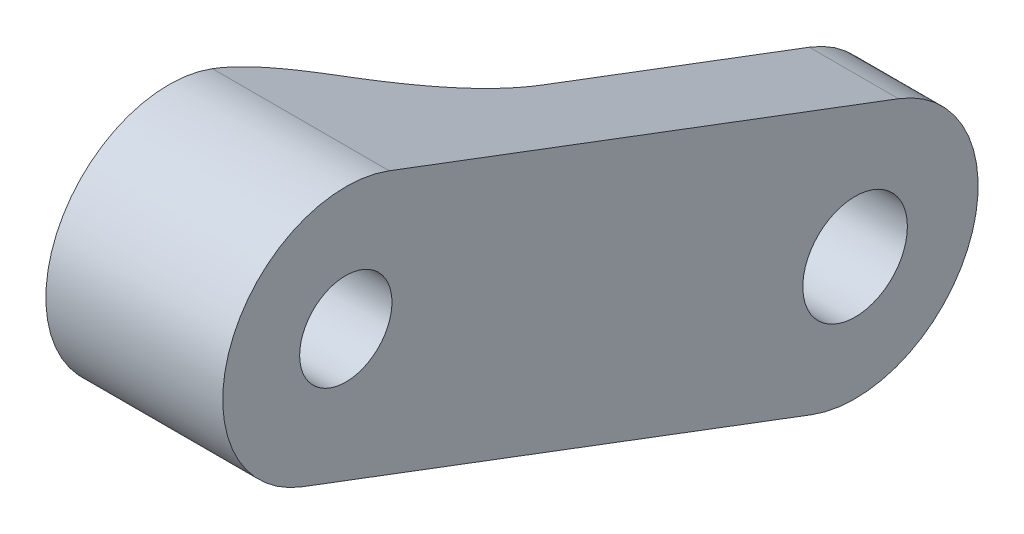
ISO-10303-21;
HEADER;
FILE_DESCRIPTION(('STEP AP214'),'2;1');
FILE_NAME('part.step','',(''),(''),'','','');
FILE_SCHEMA(('AUTOMOTIVE_DESIGN { 1 0 10303 214 1 1 1 1 }'));
ENDSEC;
DATA;
#1=APPLICATION_CONTEXT('core data for automotive mechanical design processes');
#2=APPLICATION_PROTOCOL_DEFINITION('international standard','automotive_design',2000,#1);
#3=PRODUCT_CONTEXT('',#1,'mechanical');
#4=PRODUCT('Part','Part','',(#3));
#5=PRODUCT_RELATED_PRODUCT_CATEGORY('part','',(#4));
#6=PRODUCT_DEFINITION_FORMATION('','',#4);
#7=PRODUCT_DEFINITION_CONTEXT('part definition',#1,'design');
#8=PRODUCT_DEFINITION('design','',#6,#7);
#9=PRODUCT_DEFINITION_SHAPE('','',#8);
#10=(LENGTH_UNIT() NAMED_UNIT(*) SI_UNIT(.MILLI.,.METRE.));
#11=(NAMED_UNIT(*) PLANE_ANGLE_UNIT() SI_UNIT($,.RADIAN.));
#12=(NAMED_UNIT(*) SI_UNIT($,.STERADIAN.) SOLID_ANGLE_UNIT());
#13=UNCERTAINTY_MEASURE_WITH_UNIT(LENGTH_MEASURE(1.E-05),#10,'distance_accuracy_value','');
#14=(GEOMETRIC_REPRESENTATION_CONTEXT(3) GLOBAL_UNCERTAINTY_ASSIGNED_CONTEXT((#13)) GLOBAL_UNIT_ASSIGNED_CONTEXT((#10,
#11,#12)) REPRESENTATION_CONTEXT('',''));
#15=CARTESIAN_POINT('',(0.,0.,0.));
#16=DIRECTION('',(0.,0.,1.));
#17=DIRECTION('',(1.,0.,0.));
#18=AXIS2_PLACEMENT_3D('',#15,#16,#17);
#19=CARTESIAN_POINT('',(44.302,-22.6776641920045,-71.2830619598758));
#20=DIRECTION('',(0.,0.935565570581021,-0.353153030771943));
#21=DIRECTION('',(-1.,0.,0.));
#22=AXIS2_PLACEMENT_3D('',#19,#20,#21);
#23=PLANE('',#22);
#24=DIRECTION('',(-1.,0.,0.));
#25=VECTOR('',#24,1.);
#26=CARTESIAN_POINT('',(44.302,-19.5526641920044,-63.0043777824384));
#27=LINE('',#26,#25);
#28=CARTESIAN_POINT('',(44.3,-19.5526641920044,-63.0043777824384));
#29=VERTEX_POINT('',#28);
#30=CARTESIAN_POINT('',(38.55,-19.5526641920044,-63.0043777824384));
#31=VERTEX_POINT('',#30);
#32=EDGE_CURVE('E117',#29,#31,#27,.T.);
#33=ORIENTED_EDGE('',*,*,#32,.F.);
#34=DIRECTION('',(0.,0.353153030771945,0.93556557058102));
#35=VECTOR('',#34,1.);
#36=CARTESIAN_POINT('',(44.3,-19.5526641920044,-63.0043777824384));
#37=LINE('',#36,#35);
#38=CARTESIAN_POINT('',(44.3,-25.8026641920046,-79.5617461373133));
#39=VERTEX_POINT('',#38);
#40=EDGE_CURVE('E131',#39,#29,#37,.T.);
#41=ORIENTED_EDGE('',*,*,#40,.F.);
#42=DIRECTION('',(-1.,0.,0.));
#43=VECTOR('',#42,1.);
#44=CARTESIAN_POINT('',(44.3,-25.8026641920046,-79.5617461373133));
#45=LINE('',#44,#43);
#46=CARTESIAN_POINT('',(41.4,-25.8026641920046,-79.5617461373133));
#47=VERTEX_POINT('',#46);
#48=EDGE_CURVE('E143',#39,#47,#45,.T.);
#49=ORIENTED_EDGE('',*,*,#48,.T.);
#50=DIRECTION('',(0.,0.353153030771945,0.93556557058102));
#51=VECTOR('',#50,1.);
#52=CARTESIAN_POINT('',(41.4,-19.5526641920044,-63.0043777824384));
#53=LINE('',#52,#51);
#54=CARTESIAN_POINT('',(41.4,-22.5314734420489,-70.8957765043415));
#55=VERTEX_POINT('',#54);
#56=EDGE_CURVE('E132',#47,#55,#53,.T.);
#57=ORIENTED_EDGE('',*,*,#56,.T.);
#58=CARTESIAN_POINT('',(41.4,-22.5314734420489,-70.8957765043415));
#59=CARTESIAN_POINT('',(41.4000277007138,-22.4610782446456,-70.7092870301301));
#60=CARTESIAN_POINT('',(41.3918932068011,-22.3907055309983,-70.5228571194116));
#61=CARTESIAN_POINT('',(41.3601510076592,-22.2504400113785,-70.1512686592783));
#62=CARTESIAN_POINT('',(41.3365535257737,-22.1805469191343,-69.9661093514785));
#63=CARTESIAN_POINT('',(41.2752739038295,-22.0427944731871,-69.6011784731853));
#64=CARTESIAN_POINT('',(41.2378448195937,-21.9749209159016,-69.4213692748602));
#65=CARTESIAN_POINT('',(41.1498304356229,-21.8402425746833,-69.0645822500642));
#66=CARTESIAN_POINT('',(41.0992428218886,-21.7734379809292,-68.8876049274107));
#67=CARTESIAN_POINT('',(40.964628535929,-21.6161990612663,-68.4710508933978));
#68=CARTESIAN_POINT('',(40.8751836034767,-21.5263414911862,-68.2330021114314));
#69=CARTESIAN_POINT('',(40.6763731462326,-21.3493451519056,-67.7641071375221));
#70=CARTESIAN_POINT('',(40.5669874549556,-21.2622092406282,-67.5332685167289));
#71=CARTESIAN_POINT('',(40.3892107174685,-21.132549651779,-67.1897770649979));
#72=CARTESIAN_POINT('',(40.3268212393555,-21.0889799221727,-67.0743530550437));
#73=CARTESIAN_POINT('',(40.1982796586261,-21.0025324043153,-66.845338111599));
#74=CARTESIAN_POINT('',(40.1321272404916,-20.9596546744757,-66.731747332851));
#75=CARTESIAN_POINT('',(39.9968095537605,-20.8746445187813,-66.506540218973));
#76=CARTESIAN_POINT('',(39.9276524181795,-20.8325104680575,-66.3949195792744));
#77=CARTESIAN_POINT('',(39.786851031847,-20.7487803074757,-66.1731034014878));
#78=CARTESIAN_POINT('',(39.7152075506957,-20.7071840365344,-66.0629074366616));
#79=CARTESIAN_POINT('',(39.6426406871192,-20.6657961120424,-65.9532634188603));
#80=B_SPLINE_CURVE_WITH_KNOTS('',3,(#58,#59,#60,#61,#62,#63,#64,#65,#66,#67,#68,#69,#70,#71,#72,
#73,#74,#75,#76,#77,#78,#79),.UNSPECIFIED.,.F.,.F.,(4,2,2,2,2,2,2,2,2,2,4),(0.,
0.597740368998136,1.19508594056136,1.7820041037666,2.36902554960083,3.17714083560147,
3.98607796480844,4.40077822352794,4.81551330579329,5.22918832677154,5.64273642510539),.UNSPECIFIED.);
#81=CARTESIAN_POINT('',(39.6426406871191,-20.6657961120423,-65.9532634188603));
#82=VERTEX_POINT('',#81);
#83=EDGE_CURVE('E64',#55,#82,#80,.T.);
#84=ORIENTED_EDGE('',*,*,#83,.T.);
#85=CARTESIAN_POINT('',(39.6426406871192,-20.6657961120423,-65.9532634188602));
#86=CARTESIAN_POINT('',(39.1337676519264,-20.3754395050316,-65.1840568114123));
#87=CARTESIAN_POINT('',(38.8738065002324,-20.1327943017702,-64.5412462498217));
#88=CARTESIAN_POINT('',(38.55,-19.8305564729474,-63.7405641598062));
#89=CARTESIAN_POINT('',(38.55,-19.5526641920044,-63.0043777824384));
#90=B_SPLINE_CURVE_WITH_KNOTS('',2,(#85,#86,#87,#88,#89),.UNSPECIFIED.,.F.,.F.,(3,2,3),(0.,0.5,
1.),.UNSPECIFIED.);
#91=EDGE_CURVE('E154',#82,#31,#90,.T.);
#92=ORIENTED_EDGE('',*,*,#91,.T.);
#93=EDGE_LOOP('',(#33,#41,#49,#57,#84,#92));
#94=FACE_BOUND('',#93,.T.);
#95=ADVANCED_FACE('F49',(#94),#23,.T.);
#96=CARTESIAN_POINT('',(44.302,-30.1621887566526,-68.4578377137003));
#97=DIRECTION('',(0.,0.935565570581021,-0.353153030771943));
#98=DIRECTION('',(-1.,0.,0.));
#99=AXIS2_PLACEMENT_3D('',#96,#97,#98);
#100=PLANE('',#99);
#101=CARTESIAN_POINT('',(38.55,-27.0371887566525,-60.1791535362629));
#102=CARTESIAN_POINT('',(38.55,-27.3158997168829,-60.9175087415549));
#103=CARTESIAN_POINT('',(38.8752016035928,-27.6189067923227,-61.7202287035051));
#104=CARTESIAN_POINT('',(39.1341496921302,-27.8601820570555,-62.3594100528014));
#105=CARTESIAN_POINT('',(39.6426406871248,-28.1503206766936,-63.128039172693));
#106=B_SPLINE_CURVE_WITH_KNOTS('',2,(#101,#102,#103,#104,#105),.UNSPECIFIED.,.F.,.F.,(3,2,3),
(0.,0.5,1.),.UNSPECIFIED.);
#107=CARTESIAN_POINT('',(38.55,-27.0371887566525,-60.1791535362629));
#108=VERTEX_POINT('',#107);
#109=CARTESIAN_POINT('',(39.6426406871246,-28.1503206766937,-63.1280391726931));
#110=VERTEX_POINT('',#109);
#111=EDGE_CURVE('E204',#108,#110,#106,.T.);
#112=ORIENTED_EDGE('',*,*,#111,.T.);
#113=CARTESIAN_POINT('',(39.6426406871193,-28.1503206766883,-63.1280391726914));
#114=CARTESIAN_POINT('',(39.6914424080192,-28.1781630064823,-63.2017984863247));
#115=CARTESIAN_POINT('',(39.7398349301294,-28.2060951479933,-63.2757957272715));
#116=CARTESIAN_POINT('',(39.8355918918371,-28.2621813143036,-63.4243780177031));
#117=CARTESIAN_POINT('',(39.8829562453964,-28.2903353574052,-63.4989631156738));
#118=CARTESIAN_POINT('',(40.023251008266,-28.3752295186372,-63.7238629394665));
#119=CARTESIAN_POINT('',(40.1143086862439,-28.4323596935488,-63.8752109954961));
#120=CARTESIAN_POINT('',(40.2905348470275,-28.5482357318358,-64.1821873554031));
#121=CARTESIAN_POINT('',(40.3756603954368,-28.6069897822084,-64.3378373481009));
#122=CARTESIAN_POINT('',(40.5380226255361,-28.7258291438096,-64.6526640817153));
#123=CARTESIAN_POINT('',(40.6152615373403,-28.7859140728231,-64.8118398100757));
#124=CARTESIAN_POINT('',(40.7580769875655,-28.9052598935855,-65.1280082446321));
#125=CARTESIAN_POINT('',(40.8239725745522,-28.9644729783279,-65.2848743015136));
#126=CARTESIAN_POINT('',(40.9463622522698,-29.0840972985634,-65.601780531008));
#127=CARTESIAN_POINT('',(41.002857404474,-29.1445083979163,-65.7618203429614));
#128=CARTESIAN_POINT('',(41.1054027147298,-29.2662441742484,-66.0843201974731));
#129=CARTESIAN_POINT('',(41.1514819359214,-29.3275657873976,-66.2467721233973));
#130=CARTESIAN_POINT('',(41.2325616428087,-29.4511017329167,-66.5740409482016));
#131=CARTESIAN_POINT('',(41.2675662056901,-29.5133157279136,-66.7388569533205));
#132=CARTESIAN_POINT('',(41.3134959562904,-29.6120331004263,-67.0003769372752));
#133=CARTESIAN_POINT('',(41.3283501194831,-29.6483130874683,-67.0964891147735));
#134=CARTESIAN_POINT('',(41.3539880926183,-29.7210567028155,-67.2891999683365));
#135=CARTESIAN_POINT('',(41.3647715778431,-29.7575203455358,-67.3857986825895));
#136=CARTESIAN_POINT('',(41.3822354970224,-29.8309526366641,-67.580333961526));
#137=CARTESIAN_POINT('',(41.3888720531747,-29.8679225908939,-67.6782739855653));
#138=CARTESIAN_POINT('',(41.3977553398005,-29.9419271123982,-67.874325205161));
#139=CARTESIAN_POINT('',(41.4000021716658,-29.9789616781606,-67.9724363967116));
#140=CARTESIAN_POINT('',(41.4,-30.015998006697,-68.0705522581659));
#141=B_SPLINE_CURVE_WITH_KNOTS('',3,(#113,#114,#115,#116,#117,#118,#119,#120,#121,#122,#123,
#124,#125,#126,#127,#128,#129,#130,#131,#132,#133,#134,#135,#136,#137,#138,#139,#140),
.UNSPECIFIED.,.F.,.F.,(4,2,2,2,2,2,2,2,2,2,2,2,2,4),(0.,0.278162737702129,0.556348663286724,
1.11314108256538,1.67361612233135,2.23393223437478,2.77414072420826,3.31428817360469,
3.85290933848232,4.39133197615715,4.70266180074757,5.01401645485731,5.32861205570117,
5.64320039008573),.UNSPECIFIED.);
#142=CARTESIAN_POINT('',(41.4,-30.015998006697,-68.0705522581659));
#143=VERTEX_POINT('',#142);
#144=EDGE_CURVE('E12',#110,#143,#141,.T.);
#145=ORIENTED_EDGE('',*,*,#144,.T.);
#146=DIRECTION('',(0.,-0.353153030771947,-0.935565570581019));
#147=VECTOR('',#146,1.);
#148=CARTESIAN_POINT('',(41.4,-33.2871887566527,-76.7365218911377));
#149=LINE('',#148,#147);
#150=CARTESIAN_POINT('',(41.4,-33.2871887566527,-76.7365218911377));
#151=VERTEX_POINT('',#150);
#152=EDGE_CURVE('E144',#143,#151,#149,.T.);
#153=ORIENTED_EDGE('',*,*,#152,.T.);
#154=DIRECTION('',(-1.,0.,0.));
#155=VECTOR('',#154,1.);
#156=CARTESIAN_POINT('',(44.3,-33.2871887566527,-76.7365218911377));
#157=LINE('',#156,#155);
#158=CARTESIAN_POINT('',(44.3,-33.2871887566527,-76.7365218911377));
#159=VERTEX_POINT('',#158);
#160=EDGE_CURVE('E123',#159,#151,#157,.T.);
#161=ORIENTED_EDGE('',*,*,#160,.F.);
#162=DIRECTION('',(0.,-0.353153030771947,-0.935565570581019));
#163=VECTOR('',#162,1.);
#164=CARTESIAN_POINT('',(44.3,-33.2871887566527,-76.7365218911377));
#165=LINE('',#164,#163);
#166=CARTESIAN_POINT('',(44.3,-27.0371887566525,-60.1791535362629));
#167=VERTEX_POINT('',#166);
#168=EDGE_CURVE('E120',#167,#159,#165,.T.);
#169=ORIENTED_EDGE('',*,*,#168,.F.);
#170=DIRECTION('',(-1.,0.,0.));
#171=VECTOR('',#170,1.);
#172=CARTESIAN_POINT('',(44.302,-27.0371887566525,-60.1791535362629));
#173=LINE('',#172,#171);
#174=EDGE_CURVE('E108',#167,#108,#173,.T.);
#175=ORIENTED_EDGE('',*,*,#174,.T.);
#176=EDGE_LOOP('',(#112,#145,#153,#161,#169,#175));
#177=FACE_BOUND('',#176,.T.);
#178=ADVANCED_FACE('F121',(#177),#100,.F.);
#179=CARTESIAN_POINT('',(44.302,-23.2949264743284,-61.5917656593506));
#180=DIRECTION('',(-1.,0.,0.));
#181=DIRECTION('',(0.,0.,1.));
#182=AXIS2_PLACEMENT_3D('',#179,#180,#181);
#183=CYLINDRICAL_SURFACE('',#182,4.);
#184=ORIENTED_EDGE('',*,*,#174,.F.);
#185=CARTESIAN_POINT('',(44.3,-23.2949264743284,-61.5917656593506));
#186=DIRECTION('',(1.,0.,0.));
#187=DIRECTION('',(0.,0.,1.));
#188=AXIS2_PLACEMENT_3D('',#185,#186,#187);
#189=CIRCLE('',#188,3.99999999999996);
#190=EDGE_CURVE('E112',#29,#167,#189,.T.);
#191=ORIENTED_EDGE('',*,*,#190,.F.);
#192=ORIENTED_EDGE('',*,*,#32,.T.);
#193=CARTESIAN_POINT('',(38.55,-23.2949264743284,-61.5917656593506));
#194=DIRECTION('',(-1.,0.,0.));
#195=DIRECTION('',(0.,0.,1.));
#196=AXIS2_PLACEMENT_3D('',#193,#194,#195);
#197=CIRCLE('',#196,4.);
#198=EDGE_CURVE('E114',#108,#31,#197,.T.);
#199=ORIENTED_EDGE('',*,*,#198,.F.);
#200=EDGE_LOOP('',(#184,#191,#192,#199));
#201=FACE_BOUND('',#200,.T.);
#202=ADVANCED_FACE('F110',(#201),#183,.T.);
#203=CARTESIAN_POINT('',(38.55,-23.2949264743284,-61.5917656593506));
#204=DIRECTION('',(1.,0.,0.));
#205=DIRECTION('',(0.,0.,-1.));
#206=AXIS2_PLACEMENT_3D('',#203,#204,#205);
#207=CONICAL_SURFACE('',#206,4.,0.785398163397446);
#208=ORIENTED_EDGE('',*,*,#91,.F.);
#209=CARTESIAN_POINT('',(39.6426406871193,-23.2949264743284,-61.5917656593506));
#210=DIRECTION('',(1.,0.,0.));
#211=DIRECTION('',(0.,0.,-1.));
#212=AXIS2_PLACEMENT_3D('',#209,#210,#211);
#213=CIRCLE('',#212,5.09264068711927);
#214=EDGE_CURVE('E184',#82,#110,#213,.F.);
#215=ORIENTED_EDGE('',*,*,#214,.T.);
#216=ORIENTED_EDGE('',*,*,#111,.F.);
#217=CARTESIAN_POINT('',(38.55,-23.2949264743284,-61.5917656593506));
#218=DIRECTION('',(-1.,0.,0.));
#219=DIRECTION('',(0.,0.,1.));
#220=AXIS2_PLACEMENT_3D('',#217,#218,#219);
#221=CIRCLE('',#220,4.);
#222=EDGE_CURVE('E196',#31,#108,#221,.T.);
#223=ORIENTED_EDGE('',*,*,#222,.F.);
#224=EDGE_LOOP('',(#208,#215,#216,#223));
#225=FACE_BOUND('',#224,.T.);
#226=ADVANCED_FACE('F172',(#225),#207,.T.);
#227=CARTESIAN_POINT('',(38.55,-24.4236396291636,-67.99301605393));
#228=DIRECTION('',(-1.,0.,0.));
#229=DIRECTION('',(0.,0.,1.));
#230=AXIS2_PLACEMENT_3D('',#227,#228,#229);
#231=PLANE('',#230);
#232=CARTESIAN_POINT('',(38.55,-23.2949264743284,-61.5917656593506));
#233=DIRECTION('',(-1.,0.,0.));
#234=DIRECTION('',(0.,0.,1.));
#235=AXIS2_PLACEMENT_3D('',#232,#233,#234);
#236=CIRCLE('',#235,2.70000000000001);
#237=CARTESIAN_POINT('',(38.55,-23.2949264743284,-58.8917656593506));
#238=VERTEX_POINT('',#237);
#239=EDGE_CURVE('E190',#238,#238,#236,.F.);
#240=ORIENTED_EDGE('',*,*,#239,.T.);
#241=EDGE_LOOP('',(#240));
#242=FACE_BOUND('',#241,.T.);
#243=ORIENTED_EDGE('',*,*,#222,.T.);
#244=ORIENTED_EDGE('',*,*,#198,.T.);
#245=EDGE_LOOP('',(#243,#244));
#246=FACE_BOUND('',#245,.T.);
#247=ADVANCED_FACE('F331',(#242,#246),#231,.T.);
#248=CARTESIAN_POINT('',(44.3,-29.5449264743287,-78.1491340142255));
#249=DIRECTION('',(-1.,0.,0.));
#250=DIRECTION('',(0.,0.,1.));
#251=AXIS2_PLACEMENT_3D('',#248,#249,#250);
#252=CYLINDRICAL_SURFACE('',#251,3.99999999999998);
#253=CARTESIAN_POINT('',(41.4,-29.5449264743287,-78.1491340142255));
#254=DIRECTION('',(1.,0.,0.));
#255=DIRECTION('',(0.,0.,1.));
#256=AXIS2_PLACEMENT_3D('',#253,#254,#255);
#257=CIRCLE('',#256,3.99999999999998);
#258=EDGE_CURVE('E135',#151,#47,#257,.T.);
#259=ORIENTED_EDGE('',*,*,#258,.T.);
#260=ORIENTED_EDGE('',*,*,#48,.F.);
#261=CARTESIAN_POINT('',(44.3,-29.5449264743287,-78.1491340142255));
#262=DIRECTION('',(1.,0.,0.));
#263=DIRECTION('',(0.,0.,1.));
#264=AXIS2_PLACEMENT_3D('',#261,#262,#263);
#265=CIRCLE('',#264,3.99999999999998);
#266=EDGE_CURVE('E126',#159,#39,#265,.T.);
#267=ORIENTED_EDGE('',*,*,#266,.F.);
#268=ORIENTED_EDGE('',*,*,#160,.T.);
#269=EDGE_LOOP('',(#259,#260,#267,#268));
#270=FACE_BOUND('',#269,.T.);
#271=ADVANCED_FACE('F365',(#270),#252,.T.);
#272=CARTESIAN_POINT('',(44.3,-23.2949264743284,-61.5917656593506));
#273=DIRECTION('',(-1.,0.,0.));
#274=DIRECTION('',(0.,0.,1.));
#275=AXIS2_PLACEMENT_3D('',#272,#273,#274);
#276=PLANE('',#275);
#277=CARTESIAN_POINT('',(44.3,-23.2949264743284,-61.5917656593506));
#278=DIRECTION('',(-1.,0.,0.));
#279=DIRECTION('',(0.,0.,1.));
#280=AXIS2_PLACEMENT_3D('',#277,#278,#279);
#281=CIRCLE('',#280,1.50000000000001);
#282=CARTESIAN_POINT('',(44.3,-23.2949264743284,-60.0917656593506));
#283=VERTEX_POINT('',#282);
#284=EDGE_CURVE('E197',#283,#283,#281,.T.);
#285=ORIENTED_EDGE('',*,*,#284,.T.);
#286=EDGE_LOOP('',(#285));
#287=FACE_BOUND('',#286,.T.);
#288=CARTESIAN_POINT('',(44.3,-29.5449264743287,-78.1491340142255));
#289=DIRECTION('',(1.,0.,0.));
#290=DIRECTION('',(0.,0.,-1.));
#291=AXIS2_PLACEMENT_3D('',#288,#289,#290);
#292=CIRCLE('',#291,1.70000000000001);
#293=CARTESIAN_POINT('',(44.3,-29.5449264743287,-79.8491340142255));
#294=VERTEX_POINT('',#293);
#295=EDGE_CURVE('E200',#294,#294,#292,.T.);
#296=ORIENTED_EDGE('',*,*,#295,.F.);
#297=EDGE_LOOP('',(#296));
#298=FACE_BOUND('',#297,.T.);
#299=ORIENTED_EDGE('',*,*,#190,.T.);
#300=ORIENTED_EDGE('',*,*,#168,.T.);
#301=ORIENTED_EDGE('',*,*,#266,.T.);
#302=ORIENTED_EDGE('',*,*,#40,.T.);
#303=EDGE_LOOP('',(#299,#300,#301,#302));
#304=FACE_BOUND('',#303,.T.);
#305=ADVANCED_FACE('F129',(#287,#298,#304),#276,.F.);
#306=CARTESIAN_POINT('',(41.4,-23.2949264743284,-61.5917656593506));
#307=DIRECTION('',(-1.,0.,0.));
#308=DIRECTION('',(0.,0.,1.));
#309=AXIS2_PLACEMENT_3D('',#306,#307,#308);
#310=PLANE('',#309);
#311=CARTESIAN_POINT('',(41.4,-29.5449264743287,-78.1491340142255));
#312=DIRECTION('',(-1.,0.,0.));
#313=DIRECTION('',(0.,0.,1.));
#314=AXIS2_PLACEMENT_3D('',#311,#312,#313);
#315=CIRCLE('',#314,1.70000000000001);
#316=CARTESIAN_POINT('',(41.4,-29.5449264743287,-76.4491340142255));
#317=VERTEX_POINT('',#316);
#318=EDGE_CURVE('E138',#317,#317,#315,.T.);
#319=ORIENTED_EDGE('',*,*,#318,.F.);
#320=EDGE_LOOP('',(#319));
#321=FACE_BOUND('',#320,.T.);
#322=ORIENTED_EDGE('',*,*,#152,.F.);
#323=CARTESIAN_POINT('',(41.4,-23.2949264743284,-61.5917656593506));
#324=DIRECTION('',(-1.,0.,0.));
#325=DIRECTION('',(0.,0.,1.));
#326=AXIS2_PLACEMENT_3D('',#323,#324,#325);
#327=CIRCLE('',#326,9.33528137423857);
#328=EDGE_CURVE('E188',#143,#55,#327,.F.);
#329=ORIENTED_EDGE('',*,*,#328,.T.);
#330=ORIENTED_EDGE('',*,*,#56,.F.);
#331=ORIENTED_EDGE('',*,*,#258,.F.);
#332=EDGE_LOOP('',(#322,#329,#330,#331));
#333=FACE_BOUND('',#332,.T.);
#334=ADVANCED_FACE('F391',(#321,#333),#310,.T.);
#335=CARTESIAN_POINT('',(44.3,-29.5449264743287,-78.1491340142255));
#336=DIRECTION('',(1.,0.,0.));
#337=DIRECTION('',(0.,0.,-1.));
#338=AXIS2_PLACEMENT_3D('',#335,#336,#337);
#339=CYLINDRICAL_SURFACE('',#338,1.70000000000001);
#340=ORIENTED_EDGE('',*,*,#318,.T.);
#341=EDGE_LOOP('',(#340));
#342=FACE_BOUND('',#341,.T.);
#343=ORIENTED_EDGE('',*,*,#295,.T.);
#344=EDGE_LOOP('',(#343));
#345=FACE_BOUND('',#344,.T.);
#346=ADVANCED_FACE('F396',(#342,#345),#339,.F.);
#347=CARTESIAN_POINT('',(38.55,-23.2949264743284,-61.5917656593506));
#348=DIRECTION('',(-1.,0.,0.));
#349=DIRECTION('',(0.,0.,1.));
#350=AXIS2_PLACEMENT_3D('',#347,#348,#349);
#351=CYLINDRICAL_SURFACE('',#350,1.50000000000001);
#352=CARTESIAN_POINT('',(41.35,-23.2949264743284,-61.5917656593506));
#353=DIRECTION('',(-1.,0.,0.));
#354=DIRECTION('',(0.,0.,1.));
#355=AXIS2_PLACEMENT_3D('',#352,#353,#354);
#356=CIRCLE('',#355,1.50000000000001);
#357=CARTESIAN_POINT('',(41.35,-23.2949264743284,-60.0917656593506));
#358=VERTEX_POINT('',#357);
#359=EDGE_CURVE('E201',#358,#358,#356,.T.);
#360=ORIENTED_EDGE('',*,*,#359,.T.);
#361=EDGE_LOOP('',(#360));
#362=FACE_BOUND('',#361,.T.);
#363=ORIENTED_EDGE('',*,*,#284,.F.);
#364=EDGE_LOOP('',(#363));
#365=FACE_BOUND('',#364,.T.);
#366=ADVANCED_FACE('F432',(#362,#365),#351,.F.);
#367=CARTESIAN_POINT('',(41.35,-21.7949264743284,-61.5917656593506));
#368=DIRECTION('',(1.,0.,0.));
#369=DIRECTION('',(0.,0.,-1.));
#370=AXIS2_PLACEMENT_3D('',#367,#368,#369);
#371=PLANE('',#370);
#372=ORIENTED_EDGE('',*,*,#359,.F.);
#373=EDGE_LOOP('',(#372));
#374=FACE_BOUND('',#373,.T.);
#375=CARTESIAN_POINT('',(41.35,-23.2949264743284,-61.5917656593506));
#376=DIRECTION('',(-1.,0.,0.));
#377=DIRECTION('',(0.,0.,1.));
#378=AXIS2_PLACEMENT_3D('',#375,#376,#377);
#379=CIRCLE('',#378,2.20000000000001);
#380=CARTESIAN_POINT('',(41.35,-23.2949264743284,-59.3917656593506));
#381=VERTEX_POINT('',#380);
#382=EDGE_CURVE('E515',#381,#381,#379,.T.);
#383=ORIENTED_EDGE('',*,*,#382,.T.);
#384=EDGE_LOOP('',(#383));
#385=FACE_BOUND('',#384,.T.);
#386=ADVANCED_FACE('F425',(#374,#385),#371,.F.);
#387=CARTESIAN_POINT('',(38.55,-23.2949264743284,-61.5917656593506));
#388=DIRECTION('',(-1.,0.,0.));
#389=DIRECTION('',(0.,0.,1.));
#390=AXIS2_PLACEMENT_3D('',#387,#388,#389);
#391=CYLINDRICAL_SURFACE('',#390,2.20000000000001);
#392=CARTESIAN_POINT('',(39.05,-23.2949264743284,-61.5917656593506));
#393=DIRECTION('',(-1.,0.,0.));
#394=DIRECTION('',(0.,0.,1.));
#395=AXIS2_PLACEMENT_3D('',#392,#393,#394);
#396=CIRCLE('',#395,2.20000000000001);
#397=CARTESIAN_POINT('',(39.05,-23.2949264743284,-59.3917656593506));
#398=VERTEX_POINT('',#397);
#399=EDGE_CURVE('E193',#398,#398,#396,.T.);
#400=ORIENTED_EDGE('',*,*,#399,.T.);
#401=EDGE_LOOP('',(#400));
#402=FACE_BOUND('',#401,.T.);
#403=ORIENTED_EDGE('',*,*,#382,.F.);
#404=EDGE_LOOP('',(#403));
#405=FACE_BOUND('',#404,.T.);
#406=ADVANCED_FACE('F420',(#402,#405),#391,.F.);
#407=CARTESIAN_POINT('',(39.05,-23.2949264743284,-61.5917656593506));
#408=DIRECTION('',(-1.,0.,0.));
#409=DIRECTION('',(0.,0.,1.));
#410=AXIS2_PLACEMENT_3D('',#407,#408,#409);
#411=CONICAL_SURFACE('',#410,2.20000000000001,0.785398163397462);
#412=ORIENTED_EDGE('',*,*,#239,.F.);
#413=EDGE_LOOP('',(#412));
#414=FACE_BOUND('',#413,.T.);
#415=ORIENTED_EDGE('',*,*,#399,.F.);
#416=EDGE_LOOP('',(#415));
#417=FACE_BOUND('',#416,.T.);
#418=ADVANCED_FACE('F410',(#414,#417),#411,.F.);
#419=CARTESIAN_POINT('',(35.4,-23.2949264743284,-61.5917656593506));
#420=DIRECTION('',(-1.,0.,0.));
#421=DIRECTION('',(0.,0.,1.));
#422=AXIS2_PLACEMENT_3D('',#419,#420,#421);
#423=TOROIDAL_SURFACE('',#422,9.33528137423857,6.);
#424=ORIENTED_EDGE('',*,*,#144,.F.);
#425=ORIENTED_EDGE('',*,*,#214,.F.);
#426=ORIENTED_EDGE('',*,*,#83,.F.);
#427=ORIENTED_EDGE('',*,*,#328,.F.);
#428=EDGE_LOOP('',(#424,#425,#426,#427));
#429=FACE_BOUND('',#428,.T.);
#430=ADVANCED_FACE('F51',(#429),#423,.F.);
#431=CLOSED_SHELL('',(#95,#178,#202,#226,#247,#271,#305,#334,#346,#366,#386,#406,#418,#430));
#432=MANIFOLD_SOLID_BREP('B2',#431);
#433=ADVANCED_BREP_SHAPE_REPRESENTATION('',(#18,#432),#14);
#434=SHAPE_DEFINITION_REPRESENTATION(#9,#433);
ENDSEC;
END-ISO-10303-21;
